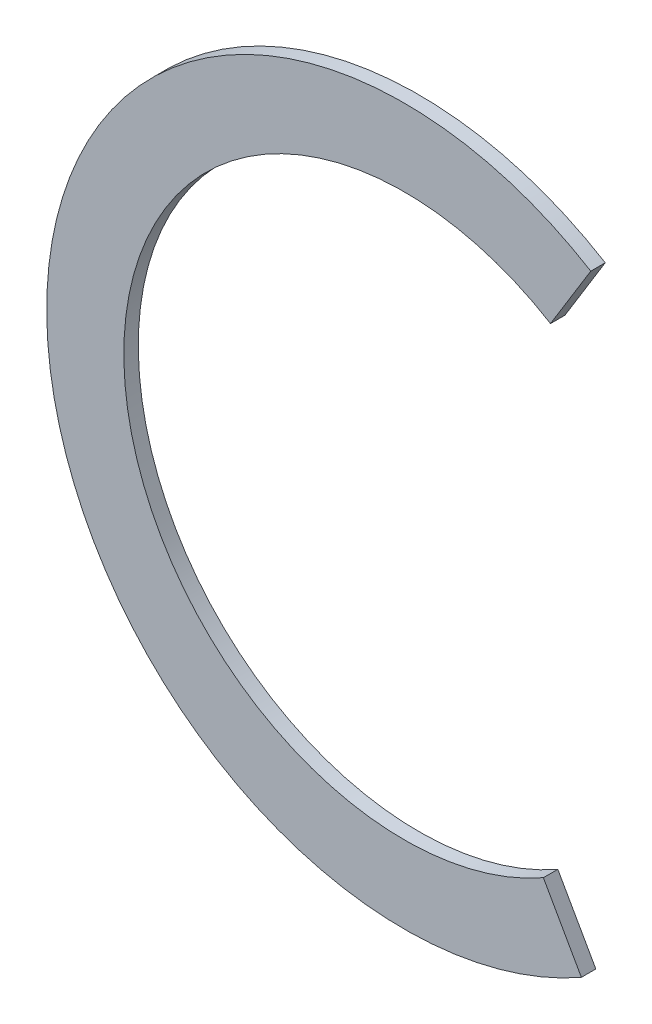
ISO-10303-21;
HEADER;
FILE_DESCRIPTION(('STEP AP214'),'2;1');
FILE_NAME('part.step','',(''),(''),'','','');
FILE_SCHEMA(('AUTOMOTIVE_DESIGN { 1 0 10303 214 1 1 1 1 }'));
ENDSEC;
DATA;
#1=APPLICATION_CONTEXT('core data for automotive mechanical design processes');
#2=APPLICATION_PROTOCOL_DEFINITION('international standard','automotive_design',2000,#1);
#3=PRODUCT_CONTEXT('',#1,'mechanical');
#4=PRODUCT('Part','Part','',(#3));
#5=PRODUCT_RELATED_PRODUCT_CATEGORY('part','',(#4));
#6=PRODUCT_DEFINITION_FORMATION('','',#4);
#7=PRODUCT_DEFINITION_CONTEXT('part definition',#1,'design');
#8=PRODUCT_DEFINITION('design','',#6,#7);
#9=PRODUCT_DEFINITION_SHAPE('','',#8);
#10=(LENGTH_UNIT() NAMED_UNIT(*) SI_UNIT(.MILLI.,.METRE.));
#11=(NAMED_UNIT(*) PLANE_ANGLE_UNIT() SI_UNIT($,.RADIAN.));
#12=(NAMED_UNIT(*) SI_UNIT($,.STERADIAN.) SOLID_ANGLE_UNIT());
#13=UNCERTAINTY_MEASURE_WITH_UNIT(LENGTH_MEASURE(1.E-05),#10,'distance_accuracy_value','');
#14=(GEOMETRIC_REPRESENTATION_CONTEXT(3) GLOBAL_UNCERTAINTY_ASSIGNED_CONTEXT((#13)) GLOBAL_UNIT_ASSIGNED_CONTEXT((#10,
#11,#12)) REPRESENTATION_CONTEXT('',''));
#15=CARTESIAN_POINT('',(0.,0.,0.));
#16=DIRECTION('',(0.,0.,1.));
#17=DIRECTION('',(1.,0.,0.));
#18=AXIS2_PLACEMENT_3D('',#15,#16,#17);
#19=CARTESIAN_POINT('',(0.,0.,0.05));
#20=DIRECTION('',(0.,0.,1.));
#21=DIRECTION('',(1.,0.,0.));
#22=AXIS2_PLACEMENT_3D('',#19,#20,#21);
#23=PLANE('',#22);
#24=CARTESIAN_POINT('',(0.9718173583728,-0.1038301482256,0.05));
#25=DIRECTION('',(0.,0.,1.));
#26=DIRECTION('',(1.,0.,0.));
#27=AXIS2_PLACEMENT_3D('',#24,#25,#26);
#28=CIRCLE('',#27,1.236230189357);
#29=CARTESIAN_POINT('',(1.58318199999987,-1.17830599999978,0.05));
#30=VERTEX_POINT('',#29);
#31=CARTESIAN_POINT('',(1.61569399999987,0.951483999999796,0.05));
#32=VERTEX_POINT('',#31);
#33=EDGE_CURVE('E76',#30,#32,#28,.F.);
#34=ORIENTED_EDGE('',*,*,#33,.F.);
#35=DIRECTION('',(-0.491524595394111,0.870863693193519,0.));
#36=VECTOR('',#35,1.);
#37=CARTESIAN_POINT('',(1.583182,-1.178306,0.05));
#38=LINE('',#37,#36);
#39=CARTESIAN_POINT('',(1.45186399999999,-0.945641999999973,0.05));
#40=VERTEX_POINT('',#39);
#41=EDGE_CURVE('E54',#40,#30,#38,.F.);
#42=ORIENTED_EDGE('',*,*,#41,.F.);
#43=CARTESIAN_POINT('',(0.9717617061004,-0.1031005907696,0.05));
#44=DIRECTION('',(0.,0.,1.));
#45=DIRECTION('',(1.,0.,0.));
#46=AXIS2_PLACEMENT_3D('',#43,#44,#45);
#47=CIRCLE('',#46,0.9697289512413);
#48=CARTESIAN_POINT('',(1.476502,0.724915999999997,0.05));
#49=VERTEX_POINT('',#48);
#50=EDGE_CURVE('E20',#40,#49,#47,.F.);
#51=ORIENTED_EDGE('',*,*,#50,.T.);
#52=DIRECTION('',(0.523457734906591,0.852051641490386,0.));
#53=VECTOR('',#52,1.);
#54=CARTESIAN_POINT('',(1.476502,0.724916,0.05));
#55=LINE('',#54,#53);
#56=EDGE_CURVE('E59',#32,#49,#55,.F.);
#57=ORIENTED_EDGE('',*,*,#56,.F.);
#58=EDGE_LOOP('',(#34,#42,#51,#57));
#59=FACE_BOUND('',#58,.T.);
#60=ADVANCED_FACE('F17',(#59),#23,.T.);
#61=CARTESIAN_POINT('',(1.583182,-1.178306,0.));
#62=DIRECTION('',(0.870863693193519,0.491524595394111,0.));
#63=DIRECTION('',(-0.491524595394111,0.870863693193519,0.));
#64=AXIS2_PLACEMENT_3D('',#61,#62,#63);
#65=PLANE('',#64);
#66=DIRECTION('',(0.,0.,1.));
#67=VECTOR('',#66,1.);
#68=CARTESIAN_POINT('',(1.58318199999987,-1.17830599999978,0.));
#69=LINE('',#68,#67);
#70=CARTESIAN_POINT('',(1.58318199999987,-1.17830599999978,0.));
#71=VERTEX_POINT('',#70);
#72=EDGE_CURVE('E73',#71,#30,#69,.T.);
#73=ORIENTED_EDGE('',*,*,#72,.F.);
#74=DIRECTION('',(-0.491524595394147,0.870863693193498,0.));
#75=VECTOR('',#74,1.);
#76=CARTESIAN_POINT('',(1.583182,-1.178306,0.));
#77=LINE('',#76,#75);
#78=CARTESIAN_POINT('',(1.45186399999999,-0.945641999999976,0.));
#79=VERTEX_POINT('',#78);
#80=EDGE_CURVE('E82',#71,#79,#77,.T.);
#81=ORIENTED_EDGE('',*,*,#80,.T.);
#82=DIRECTION('',(0.,0.,1.));
#83=VECTOR('',#82,1.);
#84=CARTESIAN_POINT('',(1.45186399999999,-0.945641999999976,0.));
#85=LINE('',#84,#83);
#86=EDGE_CURVE('E68',#79,#40,#85,.T.);
#87=ORIENTED_EDGE('',*,*,#86,.T.);
#88=ORIENTED_EDGE('',*,*,#41,.T.);
#89=EDGE_LOOP('',(#73,#81,#87,#88));
#90=FACE_BOUND('',#89,.T.);
#91=ADVANCED_FACE('F91',(#90),#65,.T.);
#92=CARTESIAN_POINT('',(0.9717617061004,-0.1031005907696,0.));
#93=DIRECTION('',(0.,0.,1.));
#94=DIRECTION('',(1.,0.,0.));
#95=AXIS2_PLACEMENT_3D('',#92,#93,#94);
#96=CYLINDRICAL_SURFACE('',#95,0.9697289512413);
#97=ORIENTED_EDGE('',*,*,#50,.F.);
#98=ORIENTED_EDGE('',*,*,#86,.F.);
#99=CARTESIAN_POINT('',(0.9717617061004,-0.1031005907696,0.));
#100=DIRECTION('',(0.,0.,1.));
#101=DIRECTION('',(1.,0.,0.));
#102=AXIS2_PLACEMENT_3D('',#99,#100,#101);
#103=CIRCLE('',#102,0.9697289512413);
#104=CARTESIAN_POINT('',(1.476502,0.724915999999997,0.));
#105=VERTEX_POINT('',#104);
#106=EDGE_CURVE('E72',#79,#105,#103,.F.);
#107=ORIENTED_EDGE('',*,*,#106,.T.);
#108=DIRECTION('',(0.,0.,1.));
#109=VECTOR('',#108,1.);
#110=CARTESIAN_POINT('',(1.476502,0.724916,0.));
#111=LINE('',#110,#109);
#112=EDGE_CURVE('E63',#49,#105,#111,.F.);
#113=ORIENTED_EDGE('',*,*,#112,.F.);
#114=EDGE_LOOP('',(#97,#98,#107,#113));
#115=FACE_BOUND('',#114,.T.);
#116=ADVANCED_FACE('F70',(#115),#96,.F.);
#117=CARTESIAN_POINT('',(1.476502,0.724916,0.));
#118=DIRECTION('',(0.852051641490386,-0.523457734906591,0.));
#119=DIRECTION('',(0.523457734906591,0.852051641490386,0.));
#120=AXIS2_PLACEMENT_3D('',#117,#118,#119);
#121=PLANE('',#120);
#122=ORIENTED_EDGE('',*,*,#112,.T.);
#123=DIRECTION('',(0.523457734906634,0.85205164149036,0.));
#124=VECTOR('',#123,1.);
#125=CARTESIAN_POINT('',(1.476502,0.724916,0.));
#126=LINE('',#125,#124);
#127=CARTESIAN_POINT('',(1.61569399999987,0.951483999999792,0.));
#128=VERTEX_POINT('',#127);
#129=EDGE_CURVE('E26',#105,#128,#126,.T.);
#130=ORIENTED_EDGE('',*,*,#129,.T.);
#131=DIRECTION('',(0.,0.,1.));
#132=VECTOR('',#131,1.);
#133=CARTESIAN_POINT('',(1.61569399999987,0.951483999999792,0.));
#134=LINE('',#133,#132);
#135=EDGE_CURVE('E34',#32,#128,#134,.F.);
#136=ORIENTED_EDGE('',*,*,#135,.F.);
#137=ORIENTED_EDGE('',*,*,#56,.T.);
#138=EDGE_LOOP('',(#122,#130,#136,#137));
#139=FACE_BOUND('',#138,.T.);
#140=ADVANCED_FACE('F60',(#139),#121,.T.);
#141=CARTESIAN_POINT('',(0.9718173583728,-0.1038301482256,0.));
#142=DIRECTION('',(0.,0.,1.));
#143=DIRECTION('',(1.,0.,0.));
#144=AXIS2_PLACEMENT_3D('',#141,#142,#143);
#145=CYLINDRICAL_SURFACE('',#144,1.236230189357);
#146=ORIENTED_EDGE('',*,*,#135,.T.);
#147=CARTESIAN_POINT('',(0.9718173583728,-0.1038301482256,0.));
#148=DIRECTION('',(0.,0.,1.));
#149=DIRECTION('',(1.,0.,0.));
#150=AXIS2_PLACEMENT_3D('',#147,#148,#149);
#151=CIRCLE('',#150,1.236230189357);
#152=EDGE_CURVE('E11',#128,#71,#151,.T.);
#153=ORIENTED_EDGE('',*,*,#152,.T.);
#154=ORIENTED_EDGE('',*,*,#72,.T.);
#155=ORIENTED_EDGE('',*,*,#33,.T.);
#156=EDGE_LOOP('',(#146,#153,#154,#155));
#157=FACE_BOUND('',#156,.T.);
#158=ADVANCED_FACE('F89',(#157),#145,.T.);
#159=CARTESIAN_POINT('',(0.,0.,0.));
#160=DIRECTION('',(0.,0.,1.));
#161=DIRECTION('',(1.,0.,0.));
#162=AXIS2_PLACEMENT_3D('',#159,#160,#161);
#163=PLANE('',#162);
#164=ORIENTED_EDGE('',*,*,#129,.F.);
#165=ORIENTED_EDGE('',*,*,#106,.F.);
#166=ORIENTED_EDGE('',*,*,#80,.F.);
#167=ORIENTED_EDGE('',*,*,#152,.F.);
#168=EDGE_LOOP('',(#164,#165,#166,#167));
#169=FACE_BOUND('',#168,.T.);
#170=ADVANCED_FACE('F87',(#169),#163,.F.);
#171=CLOSED_SHELL('',(#60,#91,#116,#140,#158,#170));
#172=MANIFOLD_SOLID_BREP('B1',#171);
#173=ADVANCED_BREP_SHAPE_REPRESENTATION('',(#18,#172),#14);
#174=SHAPE_DEFINITION_REPRESENTATION(#9,#173);
ENDSEC;
END-ISO-10303-21;
